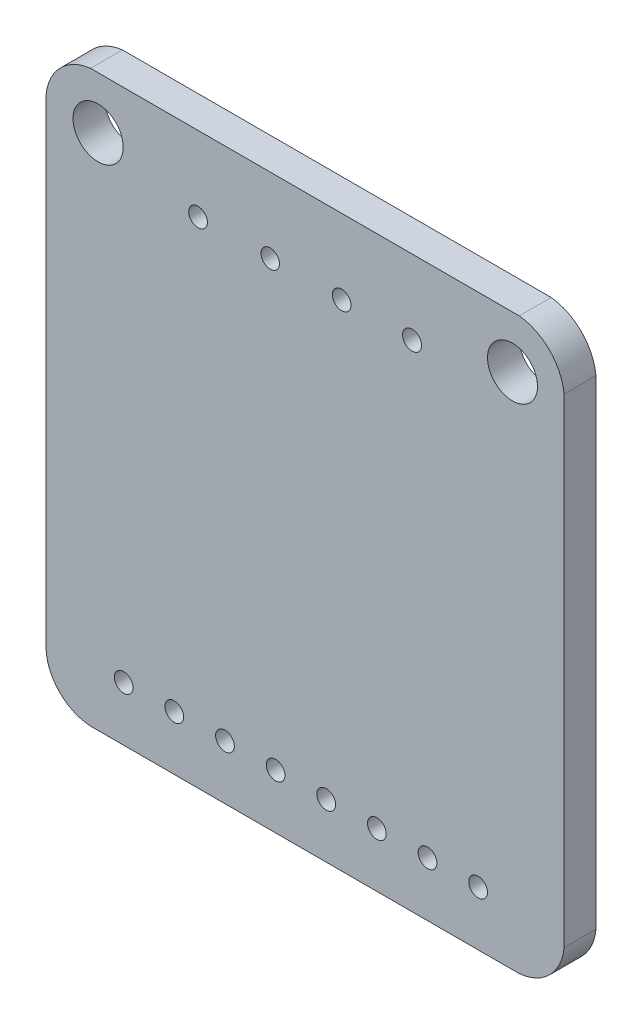
ISO-10303-21;
HEADER;
FILE_DESCRIPTION(('STEP AP214'),'2;1');
FILE_NAME('part.step','',(''),(''),'','','');
FILE_SCHEMA(('AUTOMOTIVE_DESIGN { 1 0 10303 214 1 1 1 1 }'));
ENDSEC;
DATA;
#1=APPLICATION_CONTEXT('core data for automotive mechanical design processes');
#2=APPLICATION_PROTOCOL_DEFINITION('international standard','automotive_design',2000,#1);
#3=PRODUCT_CONTEXT('',#1,'mechanical');
#4=PRODUCT('Part','Part','',(#3));
#5=PRODUCT_RELATED_PRODUCT_CATEGORY('part','',(#4));
#6=PRODUCT_DEFINITION_FORMATION('','',#4);
#7=PRODUCT_DEFINITION_CONTEXT('part definition',#1,'design');
#8=PRODUCT_DEFINITION('design','',#6,#7);
#9=PRODUCT_DEFINITION_SHAPE('','',#8);
#10=(LENGTH_UNIT() NAMED_UNIT(*) SI_UNIT(.MILLI.,.METRE.));
#11=(NAMED_UNIT(*) PLANE_ANGLE_UNIT() SI_UNIT($,.RADIAN.));
#12=(NAMED_UNIT(*) SI_UNIT($,.STERADIAN.) SOLID_ANGLE_UNIT());
#13=UNCERTAINTY_MEASURE_WITH_UNIT(LENGTH_MEASURE(1.E-05),#10,'distance_accuracy_value','');
#14=(GEOMETRIC_REPRESENTATION_CONTEXT(3) GLOBAL_UNCERTAINTY_ASSIGNED_CONTEXT((#13)) GLOBAL_UNIT_ASSIGNED_CONTEXT((#10,
#11,#12)) REPRESENTATION_CONTEXT('',''));
#15=CARTESIAN_POINT('',(0.,0.,0.));
#16=DIRECTION('',(0.,0.,1.));
#17=DIRECTION('',(1.,0.,0.));
#18=AXIS2_PLACEMENT_3D('',#15,#16,#17);
#19=CARTESIAN_POINT('',(-10.470890948568,11.044813730238,1.6));
#20=DIRECTION('',(0.,0.,1.));
#21=DIRECTION('',(1.,0.,0.));
#22=AXIS2_PLACEMENT_3D('',#19,#20,#21);
#23=PLANE('',#22);
#24=CARTESIAN_POINT('',(-10.3812089788853,10.9503976679698,1.6));
#25=DIRECTION('',(0.,0.,1.));
#26=DIRECTION('',(1.,0.,0.));
#27=AXIS2_PLACEMENT_3D('',#24,#25,#26);
#28=CIRCLE('',#27,1.25921412842314);
#29=CARTESIAN_POINT('',(-9.1219948504622,10.9503976679698,1.6));
#30=VERTEX_POINT('',#29);
#31=EDGE_CURVE('E271',#30,#30,#28,.T.);
#32=ORIENTED_EDGE('',*,*,#31,.F.);
#33=EDGE_LOOP('',(#32));
#34=FACE_BOUND('',#33,.T.);
#35=CARTESIAN_POINT('',(6.14190913883969,-12.2810449505777,1.6));
#36=DIRECTION('',(0.,0.,1.));
#37=DIRECTION('',(1.,0.,0.));
#38=AXIS2_PLACEMENT_3D('',#35,#36,#37);
#39=CIRCLE('',#38,0.470168228048299);
#40=CARTESIAN_POINT('',(6.61207736688799,-12.2810449505777,1.6));
#41=VERTEX_POINT('',#40);
#42=EDGE_CURVE('E257',#41,#41,#39,.T.);
#43=ORIENTED_EDGE('',*,*,#42,.F.);
#44=EDGE_LOOP('',(#43));
#45=FACE_BOUND('',#44,.T.);
#46=CARTESIAN_POINT('',(1.06190913883969,-12.2810449505777,1.6));
#47=DIRECTION('',(0.,0.,1.));
#48=DIRECTION('',(1.,0.,0.));
#49=AXIS2_PLACEMENT_3D('',#46,#47,#48);
#50=CIRCLE('',#49,0.470168228048299);
#51=CARTESIAN_POINT('',(1.53207736688799,-12.2810449505777,1.6));
#52=VERTEX_POINT('',#51);
#53=EDGE_CURVE('E245',#52,#52,#50,.T.);
#54=ORIENTED_EDGE('',*,*,#53,.F.);
#55=EDGE_LOOP('',(#54));
#56=FACE_BOUND('',#55,.T.);
#57=CARTESIAN_POINT('',(-4.01809086116031,-12.2810449505777,1.6));
#58=DIRECTION('',(0.,0.,1.));
#59=DIRECTION('',(1.,0.,0.));
#60=AXIS2_PLACEMENT_3D('',#57,#58,#59);
#61=CIRCLE('',#60,0.470168228048299);
#62=CARTESIAN_POINT('',(-3.54792263311201,-12.2810449505777,1.6));
#63=VERTEX_POINT('',#62);
#64=EDGE_CURVE('E231',#63,#63,#61,.T.);
#65=ORIENTED_EDGE('',*,*,#64,.F.);
#66=EDGE_LOOP('',(#65));
#67=FACE_BOUND('',#66,.T.);
#68=CARTESIAN_POINT('',(-9.09809086116031,-12.2810449505777,1.6));
#69=DIRECTION('',(0.,0.,1.));
#70=DIRECTION('',(1.,0.,0.));
#71=AXIS2_PLACEMENT_3D('',#68,#69,#70);
#72=CIRCLE('',#71,0.470168228048299);
#73=CARTESIAN_POINT('',(-8.62792263311201,-12.2810449505777,1.6));
#74=VERTEX_POINT('',#73);
#75=EDGE_CURVE('E218',#74,#74,#72,.T.);
#76=ORIENTED_EDGE('',*,*,#75,.F.);
#77=EDGE_LOOP('',(#76));
#78=FACE_BOUND('',#77,.T.);
#79=CARTESIAN_POINT('',(1.83656803565677,9.80260159524267,1.6));
#80=DIRECTION('',(0.,0.,1.));
#81=DIRECTION('',(1.,0.,0.));
#82=AXIS2_PLACEMENT_3D('',#79,#80,#81);
#83=CIRCLE('',#82,0.468000508761864);
#84=CARTESIAN_POINT('',(2.30456854441864,9.80260159524267,1.6));
#85=VERTEX_POINT('',#84);
#86=EDGE_CURVE('E203',#85,#85,#83,.T.);
#87=ORIENTED_EDGE('',*,*,#86,.F.);
#88=EDGE_LOOP('',(#87));
#89=FACE_BOUND('',#88,.T.);
#90=CARTESIAN_POINT('',(-5.36824577930525,9.8030113379883,1.6));
#91=DIRECTION('',(0.,0.,1.));
#92=DIRECTION('',(1.,0.,0.));
#93=AXIS2_PLACEMENT_3D('',#90,#91,#92);
#94=CIRCLE('',#93,0.467909585867246);
#95=CARTESIAN_POINT('',(-4.900336193438,9.8030113379883,1.6));
#96=VERTEX_POINT('',#95);
#97=EDGE_CURVE('E142',#96,#96,#94,.T.);
#98=ORIENTED_EDGE('',*,*,#97,.F.);
#99=EDGE_LOOP('',(#98));
#100=FACE_BOUND('',#99,.T.);
#101=CARTESIAN_POINT('',(-10.470890948568,11.044813730238,1.6));
#102=DIRECTION('',(0.,0.,1.));
#103=DIRECTION('',(1.,0.,0.));
#104=AXIS2_PLACEMENT_3D('',#101,#102,#103);
#105=CIRCLE('',#104,2.53715021077508);
#106=CARTESIAN_POINT('',(-10.7636925709167,13.5650118180847,1.6));
#107=VERTEX_POINT('',#106);
#108=CARTESIAN_POINT('',(-12.9958427931702,11.2933079444078,1.6));
#109=VERTEX_POINT('',#108);
#110=EDGE_CURVE('E156',#107,#109,#105,.T.);
#111=ORIENTED_EDGE('',*,*,#110,.T.);
#112=DIRECTION('',(0.,-1.,0.));
#113=VECTOR('',#112,1.);
#114=CARTESIAN_POINT('',(-12.9958427931702,11.2933079444078,1.6));
#115=LINE('',#114,#113);
#116=CARTESIAN_POINT('',(-12.9958427931702,-12.7508651977355,1.6));
#117=VERTEX_POINT('',#116);
#118=EDGE_CURVE('E99',#109,#117,#115,.T.);
#119=ORIENTED_EDGE('',*,*,#118,.T.);
#120=CARTESIAN_POINT('',(-10.6399825566357,-12.6573423021134,1.6));
#121=DIRECTION('',(0.,0.,1.));
#122=DIRECTION('',(1.,0.,0.));
#123=AXIS2_PLACEMENT_3D('',#120,#121,#122);
#124=CIRCLE('',#123,2.3577158408278);
#125=CARTESIAN_POINT('',(-10.7636925709167,-15.0118103563577,1.6));
#126=VERTEX_POINT('',#125);
#127=EDGE_CURVE('E171',#117,#126,#124,.T.);
#128=ORIENTED_EDGE('',*,*,#127,.T.);
#129=DIRECTION('',(1.,0.,0.));
#130=VECTOR('',#129,1.);
#131=CARTESIAN_POINT('',(-10.7636925709167,-15.0118103563577,1.6));
#132=LINE('',#131,#130);
#133=CARTESIAN_POINT('',(10.7458185098892,-15.0118103563577,1.6));
#134=VERTEX_POINT('',#133);
#135=EDGE_CURVE('E184',#126,#134,#132,.T.);
#136=ORIENTED_EDGE('',*,*,#135,.T.);
#137=CARTESIAN_POINT('',(10.5180400004468,-12.5369541375777,1.6));
#138=DIRECTION('',(0.,0.,1.));
#139=DIRECTION('',(-1.,0.,0.));
#140=AXIS2_PLACEMENT_3D('',#137,#138,#139);
#141=CIRCLE('',#140,2.48531614749469);
#142=CARTESIAN_POINT('',(12.9941333773896,-12.7508651977355,1.6));
#143=VERTEX_POINT('',#142);
#144=EDGE_CURVE('E118',#134,#143,#141,.T.);
#145=ORIENTED_EDGE('',*,*,#144,.T.);
#146=DIRECTION('',(0.,1.,0.));
#147=VECTOR('',#146,1.);
#148=CARTESIAN_POINT('',(12.9941333773896,-12.7508651977355,1.6));
#149=LINE('',#148,#147);
#150=CARTESIAN_POINT('',(12.9941333773896,11.2933079444078,1.6));
#151=VERTEX_POINT('',#150);
#152=EDGE_CURVE('E112',#143,#151,#149,.T.);
#153=ORIENTED_EDGE('',*,*,#152,.T.);
#154=CARTESIAN_POINT('',(10.4660117781053,11.0396506483817,1.6));
#155=DIRECTION('',(0.,0.,1.));
#156=DIRECTION('',(1.,0.,0.));
#157=AXIS2_PLACEMENT_3D('',#154,#155,#156);
#158=CIRCLE('',#157,2.54081499613711);
#159=CARTESIAN_POINT('',(10.7458185098892,13.5650118180847,1.6));
#160=VERTEX_POINT('',#159);
#161=EDGE_CURVE('E116',#151,#160,#158,.T.);
#162=ORIENTED_EDGE('',*,*,#161,.T.);
#163=DIRECTION('',(-1.,0.,0.));
#164=VECTOR('',#163,1.);
#165=CARTESIAN_POINT('',(-10.7636925709167,13.5650118180847,1.6));
#166=LINE('',#165,#164);
#167=EDGE_CURVE('E56',#160,#107,#166,.T.);
#168=ORIENTED_EDGE('',*,*,#167,.T.);
#169=EDGE_LOOP('',(#111,#119,#128,#136,#145,#153,#162,#168));
#170=FACE_BOUND('',#169,.T.);
#171=CARTESIAN_POINT('',(-1.74750654636101,9.8086250556872,1.6));
#172=DIRECTION('',(0.,0.,1.));
#173=DIRECTION('',(1.,0.,0.));
#174=AXIS2_PLACEMENT_3D('',#171,#172,#173);
#175=CIRCLE('',#174,0.462515637348421);
#176=CARTESIAN_POINT('',(-1.28499090901259,9.8086250556872,1.6));
#177=VERTEX_POINT('',#176);
#178=EDGE_CURVE('E196',#177,#177,#175,.T.);
#179=ORIENTED_EDGE('',*,*,#178,.F.);
#180=EDGE_LOOP('',(#179));
#181=FACE_BOUND('',#180,.T.);
#182=CARTESIAN_POINT('',(5.36811573664299,9.82351419097852,1.6));
#183=DIRECTION('',(0.,0.,1.));
#184=DIRECTION('',(1.,0.,0.));
#185=AXIS2_PLACEMENT_3D('',#182,#183,#184);
#186=CIRCLE('',#185,0.477564986996625);
#187=CARTESIAN_POINT('',(5.84568072363961,9.82351419097852,1.6));
#188=VERTEX_POINT('',#187);
#189=EDGE_CURVE('E210',#188,#188,#186,.T.);
#190=ORIENTED_EDGE('',*,*,#189,.F.);
#191=EDGE_LOOP('',(#190));
#192=FACE_BOUND('',#191,.T.);
#193=CARTESIAN_POINT('',(-6.55809086116031,-12.2810449505777,1.6));
#194=DIRECTION('',(0.,0.,1.));
#195=DIRECTION('',(1.,0.,0.));
#196=AXIS2_PLACEMENT_3D('',#193,#194,#195);
#197=CIRCLE('',#196,0.470168228048299);
#198=CARTESIAN_POINT('',(-6.08792263311201,-12.2810449505777,1.6));
#199=VERTEX_POINT('',#198);
#200=EDGE_CURVE('E225',#199,#199,#197,.T.);
#201=ORIENTED_EDGE('',*,*,#200,.F.);
#202=EDGE_LOOP('',(#201));
#203=FACE_BOUND('',#202,.T.);
#204=CARTESIAN_POINT('',(-1.47809086116031,-12.2810449505777,1.6));
#205=DIRECTION('',(0.,0.,1.));
#206=DIRECTION('',(1.,0.,0.));
#207=AXIS2_PLACEMENT_3D('',#204,#205,#206);
#208=CIRCLE('',#207,0.470168228048299);
#209=CARTESIAN_POINT('',(-1.00792263311201,-12.2810449505777,1.6));
#210=VERTEX_POINT('',#209);
#211=EDGE_CURVE('E238',#210,#210,#208,.T.);
#212=ORIENTED_EDGE('',*,*,#211,.F.);
#213=EDGE_LOOP('',(#212));
#214=FACE_BOUND('',#213,.T.);
#215=CARTESIAN_POINT('',(3.60190913883969,-12.2810449505777,1.6));
#216=DIRECTION('',(0.,0.,1.));
#217=DIRECTION('',(1.,0.,0.));
#218=AXIS2_PLACEMENT_3D('',#215,#216,#217);
#219=CIRCLE('',#218,0.470168228048299);
#220=CARTESIAN_POINT('',(4.07207736688799,-12.2810449505777,1.6));
#221=VERTEX_POINT('',#220);
#222=EDGE_CURVE('E251',#221,#221,#219,.T.);
#223=ORIENTED_EDGE('',*,*,#222,.F.);
#224=EDGE_LOOP('',(#223));
#225=FACE_BOUND('',#224,.T.);
#226=CARTESIAN_POINT('',(8.68190913883969,-12.2810449505777,1.6));
#227=DIRECTION('',(0.,0.,1.));
#228=DIRECTION('',(1.,0.,0.));
#229=AXIS2_PLACEMENT_3D('',#226,#227,#228);
#230=CIRCLE('',#229,0.470168228048299);
#231=CARTESIAN_POINT('',(9.15207736688799,-12.2810449505777,1.6));
#232=VERTEX_POINT('',#231);
#233=EDGE_CURVE('E265',#232,#232,#230,.T.);
#234=ORIENTED_EDGE('',*,*,#233,.F.);
#235=EDGE_LOOP('',(#234));
#236=FACE_BOUND('',#235,.T.);
#237=CARTESIAN_POINT('',(10.4052409156235,10.9544119976382,1.6));
#238=DIRECTION('',(0.,0.,1.));
#239=DIRECTION('',(1.,0.,0.));
#240=AXIS2_PLACEMENT_3D('',#237,#238,#239);
#241=CIRCLE('',#240,1.25472748155631);
#242=CARTESIAN_POINT('',(11.6599683971798,10.9544119976382,1.6));
#243=VERTEX_POINT('',#242);
#244=EDGE_CURVE('E277',#243,#243,#241,.T.);
#245=ORIENTED_EDGE('',*,*,#244,.F.);
#246=EDGE_LOOP('',(#245));
#247=FACE_BOUND('',#246,.T.);
#248=ADVANCED_FACE('F39',(#34,#45,#56,#67,#78,#89,#100,#170,#181,#192,#203,#214,#225,#236,#247),
#23,.T.);
#249=CARTESIAN_POINT('',(-10.470890948568,11.044813730238,0.));
#250=DIRECTION('',(0.,0.,1.));
#251=DIRECTION('',(1.,0.,0.));
#252=AXIS2_PLACEMENT_3D('',#249,#250,#251);
#253=PLANE('',#252);
#254=CARTESIAN_POINT('',(-10.470890948568,11.044813730238,0.));
#255=DIRECTION('',(0.,0.,1.));
#256=DIRECTION('',(1.,0.,0.));
#257=AXIS2_PLACEMENT_3D('',#254,#255,#256);
#258=CIRCLE('',#257,2.53715021077508);
#259=CARTESIAN_POINT('',(-10.7636925709167,13.5650118180847,0.));
#260=VERTEX_POINT('',#259);
#261=CARTESIAN_POINT('',(-12.9958427931702,11.2933079444078,0.));
#262=VERTEX_POINT('',#261);
#263=EDGE_CURVE('E138',#260,#262,#258,.T.);
#264=ORIENTED_EDGE('',*,*,#263,.F.);
#265=DIRECTION('',(-1.,0.,0.));
#266=VECTOR('',#265,1.);
#267=CARTESIAN_POINT('',(-10.7636925709167,13.5650118180847,0.));
#268=LINE('',#267,#266);
#269=CARTESIAN_POINT('',(10.7458185098892,13.5650118180847,0.));
#270=VERTEX_POINT('',#269);
#271=EDGE_CURVE('E91',#270,#260,#268,.T.);
#272=ORIENTED_EDGE('',*,*,#271,.F.);
#273=CARTESIAN_POINT('',(10.4660117781053,11.0396506483817,0.));
#274=DIRECTION('',(0.,0.,1.));
#275=DIRECTION('',(1.,0.,0.));
#276=AXIS2_PLACEMENT_3D('',#273,#274,#275);
#277=CIRCLE('',#276,2.54081499613711);
#278=CARTESIAN_POINT('',(12.9941333773896,11.2933079444078,0.));
#279=VERTEX_POINT('',#278);
#280=EDGE_CURVE('E85',#279,#270,#277,.T.);
#281=ORIENTED_EDGE('',*,*,#280,.F.);
#282=DIRECTION('',(0.,1.,0.));
#283=VECTOR('',#282,1.);
#284=CARTESIAN_POINT('',(12.9941333773896,-12.7508651977355,0.));
#285=LINE('',#284,#283);
#286=CARTESIAN_POINT('',(12.9941333773896,-12.7508651977355,0.));
#287=VERTEX_POINT('',#286);
#288=EDGE_CURVE('E127',#287,#279,#285,.T.);
#289=ORIENTED_EDGE('',*,*,#288,.F.);
#290=CARTESIAN_POINT('',(10.5180400004468,-12.5369541375777,0.));
#291=DIRECTION('',(0.,0.,1.));
#292=DIRECTION('',(-1.,0.,0.));
#293=AXIS2_PLACEMENT_3D('',#290,#291,#292);
#294=CIRCLE('',#293,2.48531614749469);
#295=CARTESIAN_POINT('',(10.7458185098892,-15.0118103563577,0.));
#296=VERTEX_POINT('',#295);
#297=EDGE_CURVE('E149',#296,#287,#294,.T.);
#298=ORIENTED_EDGE('',*,*,#297,.F.);
#299=DIRECTION('',(1.,0.,0.));
#300=VECTOR('',#299,1.);
#301=CARTESIAN_POINT('',(-10.7636925709167,-15.0118103563577,0.));
#302=LINE('',#301,#300);
#303=CARTESIAN_POINT('',(-10.7636925709167,-15.0118103563577,0.));
#304=VERTEX_POINT('',#303);
#305=EDGE_CURVE('E146',#304,#296,#302,.T.);
#306=ORIENTED_EDGE('',*,*,#305,.F.);
#307=CARTESIAN_POINT('',(-10.6399825566357,-12.6573423021134,0.));
#308=DIRECTION('',(0.,0.,1.));
#309=DIRECTION('',(1.,0.,0.));
#310=AXIS2_PLACEMENT_3D('',#307,#308,#309);
#311=CIRCLE('',#310,2.3577158408278);
#312=CARTESIAN_POINT('',(-12.9958427931702,-12.7508651977355,0.));
#313=VERTEX_POINT('',#312);
#314=EDGE_CURVE('E144',#313,#304,#311,.T.);
#315=ORIENTED_EDGE('',*,*,#314,.F.);
#316=DIRECTION('',(0.,-1.,0.));
#317=VECTOR('',#316,1.);
#318=CARTESIAN_POINT('',(-12.9958427931702,11.2933079444078,0.));
#319=LINE('',#318,#317);
#320=EDGE_CURVE('E141',#262,#313,#319,.T.);
#321=ORIENTED_EDGE('',*,*,#320,.F.);
#322=EDGE_LOOP('',(#264,#272,#281,#289,#298,#306,#315,#321));
#323=FACE_BOUND('',#322,.T.);
#324=CARTESIAN_POINT('',(-5.36824577930525,9.8030113379883,0.));
#325=DIRECTION('',(0.,0.,1.));
#326=DIRECTION('',(1.,0.,0.));
#327=AXIS2_PLACEMENT_3D('',#324,#325,#326);
#328=CIRCLE('',#327,0.467909585867246);
#329=CARTESIAN_POINT('',(-4.900336193438,9.8030113379883,0.));
#330=VERTEX_POINT('',#329);
#331=EDGE_CURVE('E192',#330,#330,#328,.T.);
#332=ORIENTED_EDGE('',*,*,#331,.T.);
#333=EDGE_LOOP('',(#332));
#334=FACE_BOUND('',#333,.T.);
#335=CARTESIAN_POINT('',(-1.74750654636101,9.8086250556872,0.));
#336=DIRECTION('',(0.,0.,1.));
#337=DIRECTION('',(1.,0.,0.));
#338=AXIS2_PLACEMENT_3D('',#335,#336,#337);
#339=CIRCLE('',#338,0.462515637348421);
#340=CARTESIAN_POINT('',(-1.28499090901259,9.8086250556872,0.));
#341=VERTEX_POINT('',#340);
#342=EDGE_CURVE('E199',#341,#341,#339,.T.);
#343=ORIENTED_EDGE('',*,*,#342,.T.);
#344=EDGE_LOOP('',(#343));
#345=FACE_BOUND('',#344,.T.);
#346=CARTESIAN_POINT('',(1.83656803565677,9.80260159524267,0.));
#347=DIRECTION('',(0.,0.,1.));
#348=DIRECTION('',(1.,0.,0.));
#349=AXIS2_PLACEMENT_3D('',#346,#347,#348);
#350=CIRCLE('',#349,0.468000508761864);
#351=CARTESIAN_POINT('',(2.30456854441864,9.80260159524267,0.));
#352=VERTEX_POINT('',#351);
#353=EDGE_CURVE('E206',#352,#352,#350,.T.);
#354=ORIENTED_EDGE('',*,*,#353,.T.);
#355=EDGE_LOOP('',(#354));
#356=FACE_BOUND('',#355,.T.);
#357=CARTESIAN_POINT('',(5.36811573664299,9.82351419097852,0.));
#358=DIRECTION('',(0.,0.,1.));
#359=DIRECTION('',(1.,0.,0.));
#360=AXIS2_PLACEMENT_3D('',#357,#358,#359);
#361=CIRCLE('',#360,0.477564986996625);
#362=CARTESIAN_POINT('',(5.84568072363961,9.82351419097852,0.));
#363=VERTEX_POINT('',#362);
#364=EDGE_CURVE('E214',#363,#363,#361,.T.);
#365=ORIENTED_EDGE('',*,*,#364,.T.);
#366=EDGE_LOOP('',(#365));
#367=FACE_BOUND('',#366,.T.);
#368=CARTESIAN_POINT('',(-9.09809086116031,-12.2810449505777,0.));
#369=DIRECTION('',(0.,0.,1.));
#370=DIRECTION('',(1.,0.,0.));
#371=AXIS2_PLACEMENT_3D('',#368,#369,#370);
#372=CIRCLE('',#371,0.470168228048299);
#373=CARTESIAN_POINT('',(-8.62792263311201,-12.2810449505777,0.));
#374=VERTEX_POINT('',#373);
#375=EDGE_CURVE('E222',#374,#374,#372,.T.);
#376=ORIENTED_EDGE('',*,*,#375,.T.);
#377=EDGE_LOOP('',(#376));
#378=FACE_BOUND('',#377,.T.);
#379=CARTESIAN_POINT('',(-6.55809086116031,-12.2810449505777,0.));
#380=DIRECTION('',(0.,0.,1.));
#381=DIRECTION('',(1.,0.,0.));
#382=AXIS2_PLACEMENT_3D('',#379,#380,#381);
#383=CIRCLE('',#382,0.470168228048299);
#384=CARTESIAN_POINT('',(-6.08792263311201,-12.2810449505777,0.));
#385=VERTEX_POINT('',#384);
#386=EDGE_CURVE('E228',#385,#385,#383,.T.);
#387=ORIENTED_EDGE('',*,*,#386,.T.);
#388=EDGE_LOOP('',(#387));
#389=FACE_BOUND('',#388,.T.);
#390=CARTESIAN_POINT('',(-4.01809086116031,-12.2810449505777,0.));
#391=DIRECTION('',(0.,0.,1.));
#392=DIRECTION('',(1.,0.,0.));
#393=AXIS2_PLACEMENT_3D('',#390,#391,#392);
#394=CIRCLE('',#393,0.470168228048299);
#395=CARTESIAN_POINT('',(-3.54792263311201,-12.2810449505777,0.));
#396=VERTEX_POINT('',#395);
#397=EDGE_CURVE('E234',#396,#396,#394,.T.);
#398=ORIENTED_EDGE('',*,*,#397,.T.);
#399=EDGE_LOOP('',(#398));
#400=FACE_BOUND('',#399,.T.);
#401=CARTESIAN_POINT('',(-1.47809086116031,-12.2810449505777,0.));
#402=DIRECTION('',(0.,0.,1.));
#403=DIRECTION('',(1.,0.,0.));
#404=AXIS2_PLACEMENT_3D('',#401,#402,#403);
#405=CIRCLE('',#404,0.470168228048299);
#406=CARTESIAN_POINT('',(-1.00792263311201,-12.2810449505777,0.));
#407=VERTEX_POINT('',#406);
#408=EDGE_CURVE('E242',#407,#407,#405,.T.);
#409=ORIENTED_EDGE('',*,*,#408,.T.);
#410=EDGE_LOOP('',(#409));
#411=FACE_BOUND('',#410,.T.);
#412=CARTESIAN_POINT('',(1.06190913883969,-12.2810449505777,0.));
#413=DIRECTION('',(0.,0.,1.));
#414=DIRECTION('',(1.,0.,0.));
#415=AXIS2_PLACEMENT_3D('',#412,#413,#414);
#416=CIRCLE('',#415,0.470168228048299);
#417=CARTESIAN_POINT('',(1.53207736688799,-12.2810449505777,0.));
#418=VERTEX_POINT('',#417);
#419=EDGE_CURVE('E248',#418,#418,#416,.T.);
#420=ORIENTED_EDGE('',*,*,#419,.T.);
#421=EDGE_LOOP('',(#420));
#422=FACE_BOUND('',#421,.T.);
#423=CARTESIAN_POINT('',(3.60190913883969,-12.2810449505777,0.));
#424=DIRECTION('',(0.,0.,1.));
#425=DIRECTION('',(1.,0.,0.));
#426=AXIS2_PLACEMENT_3D('',#423,#424,#425);
#427=CIRCLE('',#426,0.470168228048299);
#428=CARTESIAN_POINT('',(4.07207736688799,-12.2810449505777,0.));
#429=VERTEX_POINT('',#428);
#430=EDGE_CURVE('E254',#429,#429,#427,.T.);
#431=ORIENTED_EDGE('',*,*,#430,.T.);
#432=EDGE_LOOP('',(#431));
#433=FACE_BOUND('',#432,.T.);
#434=CARTESIAN_POINT('',(6.14190913883969,-12.2810449505777,0.));
#435=DIRECTION('',(0.,0.,1.));
#436=DIRECTION('',(1.,0.,0.));
#437=AXIS2_PLACEMENT_3D('',#434,#435,#436);
#438=CIRCLE('',#437,0.470168228048299);
#439=CARTESIAN_POINT('',(6.61207736688799,-12.2810449505777,0.));
#440=VERTEX_POINT('',#439);
#441=EDGE_CURVE('E261',#440,#440,#438,.T.);
#442=ORIENTED_EDGE('',*,*,#441,.T.);
#443=EDGE_LOOP('',(#442));
#444=FACE_BOUND('',#443,.T.);
#445=CARTESIAN_POINT('',(8.68190913883969,-12.2810449505777,0.));
#446=DIRECTION('',(0.,0.,1.));
#447=DIRECTION('',(1.,0.,0.));
#448=AXIS2_PLACEMENT_3D('',#445,#446,#447);
#449=CIRCLE('',#448,0.470168228048299);
#450=CARTESIAN_POINT('',(9.15207736688799,-12.2810449505777,0.));
#451=VERTEX_POINT('',#450);
#452=EDGE_CURVE('E268',#451,#451,#449,.T.);
#453=ORIENTED_EDGE('',*,*,#452,.T.);
#454=EDGE_LOOP('',(#453));
#455=FACE_BOUND('',#454,.T.);
#456=CARTESIAN_POINT('',(-10.3812089788853,10.9503976679698,0.));
#457=DIRECTION('',(0.,0.,1.));
#458=DIRECTION('',(1.,0.,0.));
#459=AXIS2_PLACEMENT_3D('',#456,#457,#458);
#460=CIRCLE('',#459,1.25921412842314);
#461=CARTESIAN_POINT('',(-9.1219948504622,10.9503976679698,0.));
#462=VERTEX_POINT('',#461);
#463=EDGE_CURVE('E274',#462,#462,#460,.T.);
#464=ORIENTED_EDGE('',*,*,#463,.T.);
#465=EDGE_LOOP('',(#464));
#466=FACE_BOUND('',#465,.T.);
#467=CARTESIAN_POINT('',(10.4052409156235,10.9544119976382,0.));
#468=DIRECTION('',(0.,0.,1.));
#469=DIRECTION('',(1.,0.,0.));
#470=AXIS2_PLACEMENT_3D('',#467,#468,#469);
#471=CIRCLE('',#470,1.25472748155631);
#472=CARTESIAN_POINT('',(11.6599683971798,10.9544119976382,0.));
#473=VERTEX_POINT('',#472);
#474=EDGE_CURVE('E280',#473,#473,#471,.T.);
#475=ORIENTED_EDGE('',*,*,#474,.T.);
#476=EDGE_LOOP('',(#475));
#477=FACE_BOUND('',#476,.T.);
#478=ADVANCED_FACE('F175',(#323,#334,#345,#356,#367,#378,#389,#400,#411,#422,#433,#444,#455,
#466,#477),#253,.F.);
#479=CARTESIAN_POINT('',(-10.470890948568,11.044813730238,1.6));
#480=DIRECTION('',(0.,0.,-1.));
#481=DIRECTION('',(-1.,0.,0.));
#482=AXIS2_PLACEMENT_3D('',#479,#480,#481);
#483=CYLINDRICAL_SURFACE('',#482,2.53715021077508);
#484=ORIENTED_EDGE('',*,*,#263,.T.);
#485=DIRECTION('',(0.,0.,-1.));
#486=VECTOR('',#485,1.);
#487=CARTESIAN_POINT('',(-12.9958427931702,11.2933079444078,1.6));
#488=LINE('',#487,#486);
#489=EDGE_CURVE('E11',#109,#262,#488,.T.);
#490=ORIENTED_EDGE('',*,*,#489,.F.);
#491=ORIENTED_EDGE('',*,*,#110,.F.);
#492=DIRECTION('',(0.,0.,-1.));
#493=VECTOR('',#492,1.);
#494=CARTESIAN_POINT('',(-10.7636925709167,13.5650118180847,1.6));
#495=LINE('',#494,#493);
#496=EDGE_CURVE('E134',#107,#260,#495,.T.);
#497=ORIENTED_EDGE('',*,*,#496,.T.);
#498=EDGE_LOOP('',(#484,#490,#491,#497));
#499=FACE_BOUND('',#498,.T.);
#500=ADVANCED_FACE('F41',(#499),#483,.T.);
#501=CARTESIAN_POINT('',(-12.9958427931702,11.2933079444078,1.6));
#502=DIRECTION('',(1.,0.,0.));
#503=DIRECTION('',(0.,0.,-1.));
#504=AXIS2_PLACEMENT_3D('',#501,#502,#503);
#505=PLANE('',#504);
#506=ORIENTED_EDGE('',*,*,#320,.T.);
#507=DIRECTION('',(0.,0.,-1.));
#508=VECTOR('',#507,1.);
#509=CARTESIAN_POINT('',(-12.9958427931702,-12.7508651977355,1.6));
#510=LINE('',#509,#508);
#511=EDGE_CURVE('E48',#117,#313,#510,.T.);
#512=ORIENTED_EDGE('',*,*,#511,.F.);
#513=ORIENTED_EDGE('',*,*,#118,.F.);
#514=ORIENTED_EDGE('',*,*,#489,.T.);
#515=EDGE_LOOP('',(#506,#512,#513,#514));
#516=FACE_BOUND('',#515,.T.);
#517=ADVANCED_FACE('F316',(#516),#505,.F.);
#518=CARTESIAN_POINT('',(-10.6399825566357,-12.6573423021134,1.6));
#519=DIRECTION('',(0.,0.,-1.));
#520=DIRECTION('',(-1.,0.,0.));
#521=AXIS2_PLACEMENT_3D('',#518,#519,#520);
#522=CYLINDRICAL_SURFACE('',#521,2.3577158408278);
#523=ORIENTED_EDGE('',*,*,#314,.T.);
#524=DIRECTION('',(0.,0.,-1.));
#525=VECTOR('',#524,1.);
#526=CARTESIAN_POINT('',(-10.7636925709167,-15.0118103563577,1.6));
#527=LINE('',#526,#525);
#528=EDGE_CURVE('E163',#126,#304,#527,.T.);
#529=ORIENTED_EDGE('',*,*,#528,.F.);
#530=ORIENTED_EDGE('',*,*,#127,.F.);
#531=ORIENTED_EDGE('',*,*,#511,.T.);
#532=EDGE_LOOP('',(#523,#529,#530,#531));
#533=FACE_BOUND('',#532,.T.);
#534=ADVANCED_FACE('F169',(#533),#522,.T.);
#535=CARTESIAN_POINT('',(-10.7636925709167,-15.0118103563577,1.6));
#536=DIRECTION('',(0.,1.,0.));
#537=DIRECTION('',(0.,0.,1.));
#538=AXIS2_PLACEMENT_3D('',#535,#536,#537);
#539=PLANE('',#538);
#540=ORIENTED_EDGE('',*,*,#305,.T.);
#541=DIRECTION('',(0.,0.,-1.));
#542=VECTOR('',#541,1.);
#543=CARTESIAN_POINT('',(10.7458185098892,-15.0118103563577,1.6));
#544=LINE('',#543,#542);
#545=EDGE_CURVE('E160',#134,#296,#544,.T.);
#546=ORIENTED_EDGE('',*,*,#545,.F.);
#547=ORIENTED_EDGE('',*,*,#135,.F.);
#548=ORIENTED_EDGE('',*,*,#528,.T.);
#549=EDGE_LOOP('',(#540,#546,#547,#548));
#550=FACE_BOUND('',#549,.T.);
#551=ADVANCED_FACE('F180',(#550),#539,.F.);
#552=CARTESIAN_POINT('',(10.5180400004468,-12.5369541375777,1.6));
#553=DIRECTION('',(0.,0.,-1.));
#554=DIRECTION('',(-1.,0.,0.));
#555=AXIS2_PLACEMENT_3D('',#552,#553,#554);
#556=CYLINDRICAL_SURFACE('',#555,2.48531614749469);
#557=ORIENTED_EDGE('',*,*,#297,.T.);
#558=DIRECTION('',(0.,0.,-1.));
#559=VECTOR('',#558,1.);
#560=CARTESIAN_POINT('',(12.9941333773896,-12.7508651977355,1.6));
#561=LINE('',#560,#559);
#562=EDGE_CURVE('E128',#143,#287,#561,.T.);
#563=ORIENTED_EDGE('',*,*,#562,.F.);
#564=ORIENTED_EDGE('',*,*,#144,.F.);
#565=ORIENTED_EDGE('',*,*,#545,.T.);
#566=EDGE_LOOP('',(#557,#563,#564,#565));
#567=FACE_BOUND('',#566,.T.);
#568=ADVANCED_FACE('F183',(#567),#556,.T.);
#569=CARTESIAN_POINT('',(12.9941333773896,-12.7508651977355,1.6));
#570=DIRECTION('',(-1.,0.,0.));
#571=DIRECTION('',(0.,0.,1.));
#572=AXIS2_PLACEMENT_3D('',#569,#570,#571);
#573=PLANE('',#572);
#574=ORIENTED_EDGE('',*,*,#288,.T.);
#575=DIRECTION('',(0.,0.,-1.));
#576=VECTOR('',#575,1.);
#577=CARTESIAN_POINT('',(12.9941333773896,11.2933079444078,1.6));
#578=LINE('',#577,#576);
#579=EDGE_CURVE('E124',#151,#279,#578,.T.);
#580=ORIENTED_EDGE('',*,*,#579,.F.);
#581=ORIENTED_EDGE('',*,*,#152,.F.);
#582=ORIENTED_EDGE('',*,*,#562,.T.);
#583=EDGE_LOOP('',(#574,#580,#581,#582));
#584=FACE_BOUND('',#583,.T.);
#585=ADVANCED_FACE('F125',(#584),#573,.F.);
#586=CARTESIAN_POINT('',(10.4660117781053,11.0396506483817,1.6));
#587=DIRECTION('',(0.,0.,-1.));
#588=DIRECTION('',(-1.,0.,0.));
#589=AXIS2_PLACEMENT_3D('',#586,#587,#588);
#590=CYLINDRICAL_SURFACE('',#589,2.54081499613711);
#591=ORIENTED_EDGE('',*,*,#280,.T.);
#592=DIRECTION('',(0.,0.,-1.));
#593=VECTOR('',#592,1.);
#594=CARTESIAN_POINT('',(10.7458185098892,13.5650118180847,1.6));
#595=LINE('',#594,#593);
#596=EDGE_CURVE('E129',#160,#270,#595,.T.);
#597=ORIENTED_EDGE('',*,*,#596,.F.);
#598=ORIENTED_EDGE('',*,*,#161,.F.);
#599=ORIENTED_EDGE('',*,*,#579,.T.);
#600=EDGE_LOOP('',(#591,#597,#598,#599));
#601=FACE_BOUND('',#600,.T.);
#602=ADVANCED_FACE('F131',(#601),#590,.T.);
#603=CARTESIAN_POINT('',(-10.7636925709167,13.5650118180847,1.6));
#604=DIRECTION('',(0.,-1.,0.));
#605=DIRECTION('',(0.,0.,-1.));
#606=AXIS2_PLACEMENT_3D('',#603,#604,#605);
#607=PLANE('',#606);
#608=ORIENTED_EDGE('',*,*,#271,.T.);
#609=ORIENTED_EDGE('',*,*,#496,.F.);
#610=ORIENTED_EDGE('',*,*,#167,.F.);
#611=ORIENTED_EDGE('',*,*,#596,.T.);
#612=EDGE_LOOP('',(#608,#609,#610,#611));
#613=FACE_BOUND('',#612,.T.);
#614=ADVANCED_FACE('F304',(#613),#607,.F.);
#615=CARTESIAN_POINT('',(-5.36824577930525,9.8030113379883,1.6));
#616=DIRECTION('',(0.,0.,-1.));
#617=DIRECTION('',(-1.,0.,0.));
#618=AXIS2_PLACEMENT_3D('',#615,#616,#617);
#619=CYLINDRICAL_SURFACE('',#618,0.467909585867246);
#620=ORIENTED_EDGE('',*,*,#97,.T.);
#621=EDGE_LOOP('',(#620));
#622=FACE_BOUND('',#621,.T.);
#623=ORIENTED_EDGE('',*,*,#331,.F.);
#624=EDGE_LOOP('',(#623));
#625=FACE_BOUND('',#624,.T.);
#626=ADVANCED_FACE('F301',(#622,#625),#619,.F.);
#627=CARTESIAN_POINT('',(-1.74750654636101,9.8086250556872,1.6));
#628=DIRECTION('',(0.,0.,-1.));
#629=DIRECTION('',(-1.,0.,0.));
#630=AXIS2_PLACEMENT_3D('',#627,#628,#629);
#631=CYLINDRICAL_SURFACE('',#630,0.462515637348421);
#632=ORIENTED_EDGE('',*,*,#178,.T.);
#633=EDGE_LOOP('',(#632));
#634=FACE_BOUND('',#633,.T.);
#635=ORIENTED_EDGE('',*,*,#342,.F.);
#636=EDGE_LOOP('',(#635));
#637=FACE_BOUND('',#636,.T.);
#638=ADVANCED_FACE('F394',(#634,#637),#631,.F.);
#639=CARTESIAN_POINT('',(1.83656803565677,9.80260159524267,1.6));
#640=DIRECTION('',(0.,0.,-1.));
#641=DIRECTION('',(-1.,0.,0.));
#642=AXIS2_PLACEMENT_3D('',#639,#640,#641);
#643=CYLINDRICAL_SURFACE('',#642,0.468000508761864);
#644=ORIENTED_EDGE('',*,*,#86,.T.);
#645=EDGE_LOOP('',(#644));
#646=FACE_BOUND('',#645,.T.);
#647=ORIENTED_EDGE('',*,*,#353,.F.);
#648=EDGE_LOOP('',(#647));
#649=FACE_BOUND('',#648,.T.);
#650=ADVANCED_FACE('F403',(#646,#649),#643,.F.);
#651=CARTESIAN_POINT('',(5.36811573664299,9.82351419097852,1.6));
#652=DIRECTION('',(0.,0.,-1.));
#653=DIRECTION('',(-1.,0.,0.));
#654=AXIS2_PLACEMENT_3D('',#651,#652,#653);
#655=CYLINDRICAL_SURFACE('',#654,0.477564986996625);
#656=ORIENTED_EDGE('',*,*,#189,.T.);
#657=EDGE_LOOP('',(#656));
#658=FACE_BOUND('',#657,.T.);
#659=ORIENTED_EDGE('',*,*,#364,.F.);
#660=EDGE_LOOP('',(#659));
#661=FACE_BOUND('',#660,.T.);
#662=ADVANCED_FACE('F413',(#658,#661),#655,.F.);
#663=CARTESIAN_POINT('',(-9.09809086116031,-12.2810449505777,1.6));
#664=DIRECTION('',(0.,0.,-1.));
#665=DIRECTION('',(-1.,0.,0.));
#666=AXIS2_PLACEMENT_3D('',#663,#664,#665);
#667=CYLINDRICAL_SURFACE('',#666,0.470168228048299);
#668=ORIENTED_EDGE('',*,*,#75,.T.);
#669=EDGE_LOOP('',(#668));
#670=FACE_BOUND('',#669,.T.);
#671=ORIENTED_EDGE('',*,*,#375,.F.);
#672=EDGE_LOOP('',(#671));
#673=FACE_BOUND('',#672,.T.);
#674=ADVANCED_FACE('F422',(#670,#673),#667,.F.);
#675=CARTESIAN_POINT('',(-6.55809086116031,-12.2810449505777,1.6));
#676=DIRECTION('',(0.,0.,-1.));
#677=DIRECTION('',(-1.,0.,0.));
#678=AXIS2_PLACEMENT_3D('',#675,#676,#677);
#679=CYLINDRICAL_SURFACE('',#678,0.470168228048299);
#680=ORIENTED_EDGE('',*,*,#200,.T.);
#681=EDGE_LOOP('',(#680));
#682=FACE_BOUND('',#681,.T.);
#683=ORIENTED_EDGE('',*,*,#386,.F.);
#684=EDGE_LOOP('',(#683));
#685=FACE_BOUND('',#684,.T.);
#686=ADVANCED_FACE('F431',(#682,#685),#679,.F.);
#687=CARTESIAN_POINT('',(-4.01809086116031,-12.2810449505777,1.6));
#688=DIRECTION('',(0.,0.,-1.));
#689=DIRECTION('',(-1.,0.,0.));
#690=AXIS2_PLACEMENT_3D('',#687,#688,#689);
#691=CYLINDRICAL_SURFACE('',#690,0.470168228048299);
#692=ORIENTED_EDGE('',*,*,#64,.T.);
#693=EDGE_LOOP('',(#692));
#694=FACE_BOUND('',#693,.T.);
#695=ORIENTED_EDGE('',*,*,#397,.F.);
#696=EDGE_LOOP('',(#695));
#697=FACE_BOUND('',#696,.T.);
#698=ADVANCED_FACE('F441',(#694,#697),#691,.F.);
#699=CARTESIAN_POINT('',(-1.47809086116031,-12.2810449505777,1.6));
#700=DIRECTION('',(0.,0.,-1.));
#701=DIRECTION('',(-1.,0.,0.));
#702=AXIS2_PLACEMENT_3D('',#699,#700,#701);
#703=CYLINDRICAL_SURFACE('',#702,0.470168228048299);
#704=ORIENTED_EDGE('',*,*,#211,.T.);
#705=EDGE_LOOP('',(#704));
#706=FACE_BOUND('',#705,.T.);
#707=ORIENTED_EDGE('',*,*,#408,.F.);
#708=EDGE_LOOP('',(#707));
#709=FACE_BOUND('',#708,.T.);
#710=ADVANCED_FACE('F451',(#706,#709),#703,.F.);
#711=CARTESIAN_POINT('',(1.06190913883969,-12.2810449505777,1.6));
#712=DIRECTION('',(0.,0.,-1.));
#713=DIRECTION('',(-1.,0.,0.));
#714=AXIS2_PLACEMENT_3D('',#711,#712,#713);
#715=CYLINDRICAL_SURFACE('',#714,0.470168228048299);
#716=ORIENTED_EDGE('',*,*,#53,.T.);
#717=EDGE_LOOP('',(#716));
#718=FACE_BOUND('',#717,.T.);
#719=ORIENTED_EDGE('',*,*,#419,.F.);
#720=EDGE_LOOP('',(#719));
#721=FACE_BOUND('',#720,.T.);
#722=ADVANCED_FACE('F460',(#718,#721),#715,.F.);
#723=CARTESIAN_POINT('',(3.60190913883969,-12.2810449505777,1.6));
#724=DIRECTION('',(0.,0.,-1.));
#725=DIRECTION('',(-1.,0.,0.));
#726=AXIS2_PLACEMENT_3D('',#723,#724,#725);
#727=CYLINDRICAL_SURFACE('',#726,0.470168228048299);
#728=ORIENTED_EDGE('',*,*,#222,.T.);
#729=EDGE_LOOP('',(#728));
#730=FACE_BOUND('',#729,.T.);
#731=ORIENTED_EDGE('',*,*,#430,.F.);
#732=EDGE_LOOP('',(#731));
#733=FACE_BOUND('',#732,.T.);
#734=ADVANCED_FACE('F470',(#730,#733),#727,.F.);
#735=CARTESIAN_POINT('',(6.14190913883969,-12.2810449505777,1.6));
#736=DIRECTION('',(0.,0.,-1.));
#737=DIRECTION('',(-1.,0.,0.));
#738=AXIS2_PLACEMENT_3D('',#735,#736,#737);
#739=CYLINDRICAL_SURFACE('',#738,0.470168228048299);
#740=ORIENTED_EDGE('',*,*,#42,.T.);
#741=EDGE_LOOP('',(#740));
#742=FACE_BOUND('',#741,.T.);
#743=ORIENTED_EDGE('',*,*,#441,.F.);
#744=EDGE_LOOP('',(#743));
#745=FACE_BOUND('',#744,.T.);
#746=ADVANCED_FACE('F480',(#742,#745),#739,.F.);
#747=CARTESIAN_POINT('',(8.68190913883969,-12.2810449505777,1.6));
#748=DIRECTION('',(0.,0.,-1.));
#749=DIRECTION('',(-1.,0.,0.));
#750=AXIS2_PLACEMENT_3D('',#747,#748,#749);
#751=CYLINDRICAL_SURFACE('',#750,0.470168228048299);
#752=ORIENTED_EDGE('',*,*,#233,.T.);
#753=EDGE_LOOP('',(#752));
#754=FACE_BOUND('',#753,.T.);
#755=ORIENTED_EDGE('',*,*,#452,.F.);
#756=EDGE_LOOP('',(#755));
#757=FACE_BOUND('',#756,.T.);
#758=ADVANCED_FACE('F490',(#754,#757),#751,.F.);
#759=CARTESIAN_POINT('',(-10.3812089788853,10.9503976679698,1.6));
#760=DIRECTION('',(0.,0.,-1.));
#761=DIRECTION('',(-1.,0.,0.));
#762=AXIS2_PLACEMENT_3D('',#759,#760,#761);
#763=CYLINDRICAL_SURFACE('',#762,1.25921412842314);
#764=ORIENTED_EDGE('',*,*,#31,.T.);
#765=EDGE_LOOP('',(#764));
#766=FACE_BOUND('',#765,.T.);
#767=ORIENTED_EDGE('',*,*,#463,.F.);
#768=EDGE_LOOP('',(#767));
#769=FACE_BOUND('',#768,.T.);
#770=ADVANCED_FACE('F499',(#766,#769),#763,.F.);
#771=CARTESIAN_POINT('',(10.4052409156235,10.9544119976382,1.6));
#772=DIRECTION('',(0.,0.,-1.));
#773=DIRECTION('',(-1.,0.,0.));
#774=AXIS2_PLACEMENT_3D('',#771,#772,#773);
#775=CYLINDRICAL_SURFACE('',#774,1.25472748155631);
#776=ORIENTED_EDGE('',*,*,#244,.T.);
#777=EDGE_LOOP('',(#776));
#778=FACE_BOUND('',#777,.T.);
#779=ORIENTED_EDGE('',*,*,#474,.F.);
#780=EDGE_LOOP('',(#779));
#781=FACE_BOUND('',#780,.T.);
#782=ADVANCED_FACE('F288',(#778,#781),#775,.F.);
#783=CLOSED_SHELL('',(#248,#478,#500,#517,#534,#551,#568,#585,#602,#614,#626,#638,#650,#662,
#674,#686,#698,#710,#722,#734,#746,#758,#770,#782));
#784=MANIFOLD_SOLID_BREP('B2',#783);
#785=ADVANCED_BREP_SHAPE_REPRESENTATION('',(#18,#784),#14);
#786=SHAPE_DEFINITION_REPRESENTATION(#9,#785);
ENDSEC;
END-ISO-10303-21;
